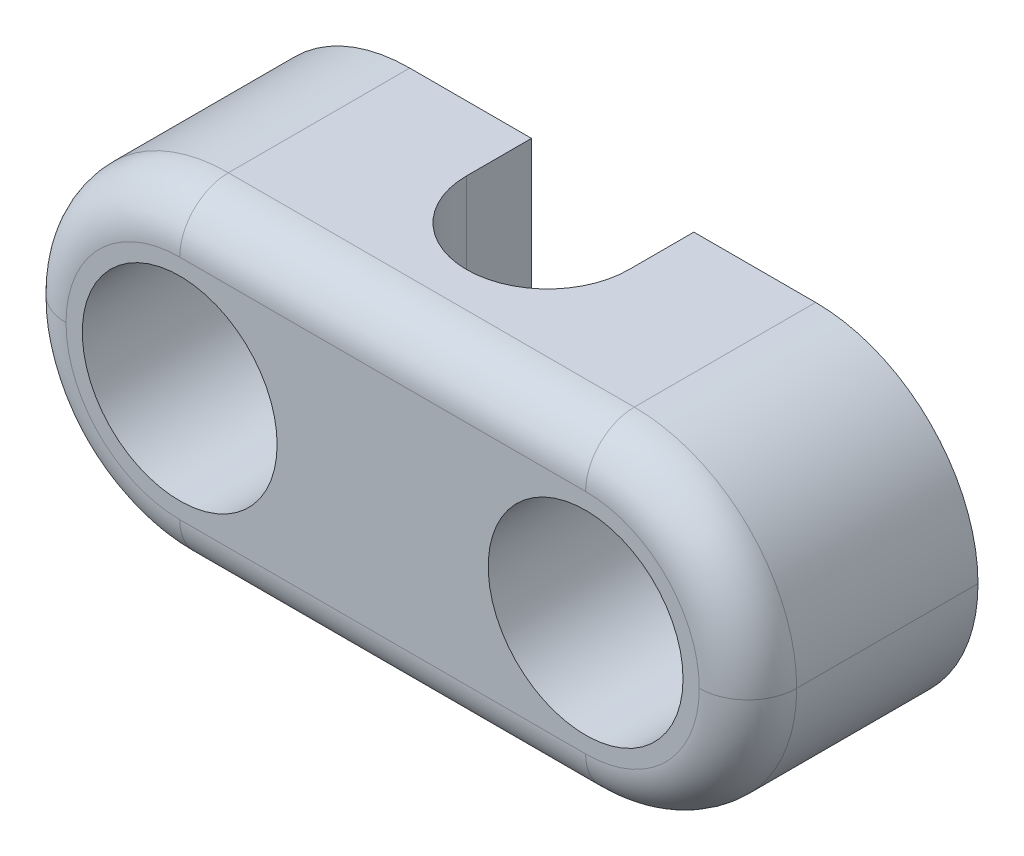
ISO-10303-21;
HEADER;
FILE_DESCRIPTION(('STEP AP214'),'2;1');
FILE_NAME('part.step','',(''),(''),'','','');
FILE_SCHEMA(('AUTOMOTIVE_DESIGN { 1 0 10303 214 1 1 1 1 }'));
ENDSEC;
DATA;
#1=APPLICATION_CONTEXT('core data for automotive mechanical design processes');
#2=APPLICATION_PROTOCOL_DEFINITION('international standard','automotive_design',2000,#1);
#3=PRODUCT_CONTEXT('',#1,'mechanical');
#4=PRODUCT('Part','Part','',(#3));
#5=PRODUCT_RELATED_PRODUCT_CATEGORY('part','',(#4));
#6=PRODUCT_DEFINITION_FORMATION('','',#4);
#7=PRODUCT_DEFINITION_CONTEXT('part definition',#1,'design');
#8=PRODUCT_DEFINITION('design','',#6,#7);
#9=PRODUCT_DEFINITION_SHAPE('','',#8);
#10=(LENGTH_UNIT() NAMED_UNIT(*) SI_UNIT(.MILLI.,.METRE.));
#11=(NAMED_UNIT(*) PLANE_ANGLE_UNIT() SI_UNIT($,.RADIAN.));
#12=(NAMED_UNIT(*) SI_UNIT($,.STERADIAN.) SOLID_ANGLE_UNIT());
#13=UNCERTAINTY_MEASURE_WITH_UNIT(LENGTH_MEASURE(1.E-05),#10,'distance_accuracy_value','');
#14=(GEOMETRIC_REPRESENTATION_CONTEXT(3) GLOBAL_UNCERTAINTY_ASSIGNED_CONTEXT((#13)) GLOBAL_UNIT_ASSIGNED_CONTEXT((#10,
#11,#12)) REPRESENTATION_CONTEXT('',''));
#15=CARTESIAN_POINT('',(0.,0.,0.));
#16=DIRECTION('',(0.,0.,1.));
#17=DIRECTION('',(1.,0.,0.));
#18=AXIS2_PLACEMENT_3D('',#15,#16,#17);
#19=CARTESIAN_POINT('',(0.,0.,0.));
#20=DIRECTION('',(0.,0.,-1.));
#21=DIRECTION('',(-1.,0.,0.));
#22=AXIS2_PLACEMENT_3D('',#19,#20,#21);
#23=PLANE('',#22);
#24=DIRECTION('',(0.,1.,0.));
#25=VECTOR('',#24,1.);
#26=CARTESIAN_POINT('',(-5.,0.,0.));
#27=LINE('',#26,#25);
#28=CARTESIAN_POINT('',(-5.,-10.,0.));
#29=VERTEX_POINT('',#28);
#30=CARTESIAN_POINT('',(-5.,10.,0.));
#31=VERTEX_POINT('',#30);
#32=EDGE_CURVE('E147',#29,#31,#27,.T.);
#33=ORIENTED_EDGE('',*,*,#32,.F.);
#34=DIRECTION('',(1.,0.,0.));
#35=VECTOR('',#34,1.);
#36=CARTESIAN_POINT('',(-22.5,-10.,0.));
#37=LINE('',#36,#35);
#38=CARTESIAN_POINT('',(-12.5,-10.,0.));
#39=VERTEX_POINT('',#38);
#40=EDGE_CURVE('E163',#39,#29,#37,.T.);
#41=ORIENTED_EDGE('',*,*,#40,.F.);
#42=CARTESIAN_POINT('',(-12.5,0.,0.));
#43=DIRECTION('',(0.,0.,-1.));
#44=DIRECTION('',(-1.,0.,0.));
#45=AXIS2_PLACEMENT_3D('',#42,#43,#44);
#46=CIRCLE('',#45,10.);
#47=CARTESIAN_POINT('',(-22.5,0.,0.));
#48=VERTEX_POINT('',#47);
#49=EDGE_CURVE('E176',#39,#48,#46,.T.);
#50=ORIENTED_EDGE('',*,*,#49,.T.);
#51=CARTESIAN_POINT('',(-12.5,0.,0.));
#52=DIRECTION('',(0.,0.,-1.));
#53=DIRECTION('',(-1.,0.,0.));
#54=AXIS2_PLACEMENT_3D('',#51,#52,#53);
#55=CIRCLE('',#54,10.);
#56=CARTESIAN_POINT('',(-12.5,10.,0.));
#57=VERTEX_POINT('',#56);
#58=EDGE_CURVE('E178',#48,#57,#55,.T.);
#59=ORIENTED_EDGE('',*,*,#58,.T.);
#60=DIRECTION('',(-1.,0.,0.));
#61=VECTOR('',#60,1.);
#62=CARTESIAN_POINT('',(-22.5,10.,0.));
#63=LINE('',#62,#61);
#64=EDGE_CURVE('E168',#31,#57,#63,.T.);
#65=ORIENTED_EDGE('',*,*,#64,.F.);
#66=EDGE_LOOP('',(#33,#41,#50,#59,#65));
#67=FACE_BOUND('',#66,.T.);
#68=CARTESIAN_POINT('',(-12.5,0.,0.));
#69=DIRECTION('',(0.,0.,1.));
#70=DIRECTION('',(1.,0.,0.));
#71=AXIS2_PLACEMENT_3D('',#68,#69,#70);
#72=CIRCLE('',#71,2.75);
#73=CARTESIAN_POINT('',(-9.75,0.,0.));
#74=VERTEX_POINT('',#73);
#75=EDGE_CURVE('E247',#74,#74,#72,.T.);
#76=ORIENTED_EDGE('',*,*,#75,.T.);
#77=EDGE_LOOP('',(#76));
#78=FACE_BOUND('',#77,.T.);
#79=ADVANCED_FACE('F38',(#67,#78),#23,.T.);
#80=CARTESIAN_POINT('',(-22.5,10.,14.1678726496991));
#81=DIRECTION('',(0.,-1.,0.));
#82=DIRECTION('',(0.,0.,-1.));
#83=AXIS2_PLACEMENT_3D('',#80,#81,#82);
#84=PLANE('',#83);
#85=DIRECTION('',(0.,0.,-1.));
#86=VECTOR('',#85,1.);
#87=CARTESIAN_POINT('',(-12.5,10.,14.1678726496991));
#88=LINE('',#87,#86);
#89=CARTESIAN_POINT('',(-12.5,10.,11.1678726496991));
#90=VERTEX_POINT('',#89);
#91=EDGE_CURVE('E167',#57,#90,#88,.F.);
#92=ORIENTED_EDGE('',*,*,#91,.T.);
#93=DIRECTION('',(-1.,0.,0.));
#94=VECTOR('',#93,1.);
#95=CARTESIAN_POINT('',(-22.5,10.,11.1678726496991));
#96=LINE('',#95,#94);
#97=CARTESIAN_POINT('',(12.5,10.,11.1678726496991));
#98=VERTEX_POINT('',#97);
#99=EDGE_CURVE('E212',#90,#98,#96,.F.);
#100=ORIENTED_EDGE('',*,*,#99,.T.);
#101=DIRECTION('',(0.,0.,-1.));
#102=VECTOR('',#101,1.);
#103=CARTESIAN_POINT('',(12.5,10.,14.1678726496991));
#104=LINE('',#103,#102);
#105=CARTESIAN_POINT('',(12.5,10.,0.));
#106=VERTEX_POINT('',#105);
#107=EDGE_CURVE('E174',#98,#106,#104,.T.);
#108=ORIENTED_EDGE('',*,*,#107,.T.);
#109=CARTESIAN_POINT('',(4.99999999999999,10.,0.));
#110=VERTEX_POINT('',#109);
#111=EDGE_CURVE('E164',#106,#110,#63,.T.);
#112=ORIENTED_EDGE('',*,*,#111,.T.);
#113=DIRECTION('',(0.,0.,1.));
#114=VECTOR('',#113,1.);
#115=CARTESIAN_POINT('',(5.,10.,14.1678726496991));
#116=LINE('',#115,#114);
#117=CARTESIAN_POINT('',(5.,10.,4.));
#118=VERTEX_POINT('',#117);
#119=EDGE_CURVE('E142',#110,#118,#116,.T.);
#120=ORIENTED_EDGE('',*,*,#119,.T.);
#121=CARTESIAN_POINT('',(0.,10.,4.));
#122=DIRECTION('',(0.,-1.,0.));
#123=DIRECTION('',(0.,0.,-1.));
#124=AXIS2_PLACEMENT_3D('',#121,#122,#123);
#125=CIRCLE('',#124,5.);
#126=CARTESIAN_POINT('',(-5.,10.,4.));
#127=VERTEX_POINT('',#126);
#128=EDGE_CURVE('E191',#118,#127,#125,.T.);
#129=ORIENTED_EDGE('',*,*,#128,.T.);
#130=DIRECTION('',(0.,0.,-1.));
#131=VECTOR('',#130,1.);
#132=CARTESIAN_POINT('',(-5.,10.,14.1678726496991));
#133=LINE('',#132,#131);
#134=EDGE_CURVE('E269',#127,#31,#133,.T.);
#135=ORIENTED_EDGE('',*,*,#134,.T.);
#136=ORIENTED_EDGE('',*,*,#64,.T.);
#137=EDGE_LOOP('',(#92,#100,#108,#112,#120,#129,#135,#136));
#138=FACE_BOUND('',#137,.T.);
#139=ADVANCED_FACE('F273',(#138),#84,.F.);
#140=CARTESIAN_POINT('',(-22.5,-10.,14.1678726496991));
#141=DIRECTION('',(0.,1.,0.));
#142=DIRECTION('',(0.,0.,1.));
#143=AXIS2_PLACEMENT_3D('',#140,#141,#142);
#144=PLANE('',#143);
#145=DIRECTION('',(0.,0.,-1.));
#146=VECTOR('',#145,1.);
#147=CARTESIAN_POINT('',(12.5,-10.,14.1678726496991));
#148=LINE('',#147,#146);
#149=CARTESIAN_POINT('',(12.5,-10.,0.));
#150=VERTEX_POINT('',#149);
#151=CARTESIAN_POINT('',(12.5,-10.,11.1678726496991));
#152=VERTEX_POINT('',#151);
#153=EDGE_CURVE('E148',#150,#152,#148,.F.);
#154=ORIENTED_EDGE('',*,*,#153,.T.);
#155=DIRECTION('',(1.,0.,0.));
#156=VECTOR('',#155,1.);
#157=CARTESIAN_POINT('',(-22.5,-10.,11.1678726496991));
#158=LINE('',#157,#156);
#159=CARTESIAN_POINT('',(-12.5,-10.,11.1678726496991));
#160=VERTEX_POINT('',#159);
#161=EDGE_CURVE('E11',#152,#160,#158,.F.);
#162=ORIENTED_EDGE('',*,*,#161,.T.);
#163=DIRECTION('',(0.,0.,-1.));
#164=VECTOR('',#163,1.);
#165=CARTESIAN_POINT('',(-12.5,-10.,14.1678726496991));
#166=LINE('',#165,#164);
#167=EDGE_CURVE('E184',#160,#39,#166,.T.);
#168=ORIENTED_EDGE('',*,*,#167,.T.);
#169=ORIENTED_EDGE('',*,*,#40,.T.);
#170=DIRECTION('',(0.,0.,-1.));
#171=VECTOR('',#170,1.);
#172=CARTESIAN_POINT('',(-5.,-10.,0.));
#173=LINE('',#172,#171);
#174=CARTESIAN_POINT('',(-5.,-10.,4.));
#175=VERTEX_POINT('',#174);
#176=EDGE_CURVE('E262',#175,#29,#173,.T.);
#177=ORIENTED_EDGE('',*,*,#176,.F.);
#178=CARTESIAN_POINT('',(0.,-10.,4.));
#179=DIRECTION('',(0.,-1.,0.));
#180=DIRECTION('',(0.,0.,-1.));
#181=AXIS2_PLACEMENT_3D('',#178,#179,#180);
#182=CIRCLE('',#181,5.);
#183=CARTESIAN_POINT('',(5.,-10.,4.));
#184=VERTEX_POINT('',#183);
#185=EDGE_CURVE('E156',#184,#175,#182,.T.);
#186=ORIENTED_EDGE('',*,*,#185,.F.);
#187=DIRECTION('',(0.,0.,1.));
#188=VECTOR('',#187,1.);
#189=CARTESIAN_POINT('',(5.,-10.,0.));
#190=LINE('',#189,#188);
#191=CARTESIAN_POINT('',(5.,-10.,0.));
#192=VERTEX_POINT('',#191);
#193=EDGE_CURVE('E139',#192,#184,#190,.T.);
#194=ORIENTED_EDGE('',*,*,#193,.F.);
#195=EDGE_CURVE('E152',#192,#150,#37,.T.);
#196=ORIENTED_EDGE('',*,*,#195,.T.);
#197=EDGE_LOOP('',(#154,#162,#168,#169,#177,#186,#194,#196));
#198=FACE_BOUND('',#197,.T.);
#199=ADVANCED_FACE('F151',(#198),#144,.F.);
#200=CARTESIAN_POINT('',(0.,0.,14.1678726496991));
#201=DIRECTION('',(0.,0.,-1.));
#202=DIRECTION('',(-1.,0.,0.));
#203=AXIS2_PLACEMENT_3D('',#200,#201,#202);
#204=PLANE('',#203);
#205=CARTESIAN_POINT('',(-12.5,0.,14.1678726496991));
#206=DIRECTION('',(0.,0.,-1.));
#207=DIRECTION('',(-1.,0.,0.));
#208=AXIS2_PLACEMENT_3D('',#205,#206,#207);
#209=CIRCLE('',#208,7.);
#210=CARTESIAN_POINT('',(-12.5,7.,14.1678726496991));
#211=VERTEX_POINT('',#210);
#212=CARTESIAN_POINT('',(-19.5,0.,14.1678726496991));
#213=VERTEX_POINT('',#212);
#214=EDGE_CURVE('E202',#211,#213,#209,.F.);
#215=ORIENTED_EDGE('',*,*,#214,.T.);
#216=CARTESIAN_POINT('',(-12.5,0.,14.1678726496991));
#217=DIRECTION('',(0.,0.,-1.));
#218=DIRECTION('',(-1.,0.,0.));
#219=AXIS2_PLACEMENT_3D('',#216,#217,#218);
#220=CIRCLE('',#219,7.);
#221=CARTESIAN_POINT('',(-12.5,-7.,14.1678726496991));
#222=VERTEX_POINT('',#221);
#223=EDGE_CURVE('E204',#213,#222,#220,.F.);
#224=ORIENTED_EDGE('',*,*,#223,.T.);
#225=DIRECTION('',(1.,0.,0.));
#226=VECTOR('',#225,1.);
#227=CARTESIAN_POINT('',(0.,-7.,14.1678726496991));
#228=LINE('',#227,#226);
#229=CARTESIAN_POINT('',(12.5,-7.,14.1678726496991));
#230=VERTEX_POINT('',#229);
#231=EDGE_CURVE('E194',#222,#230,#228,.T.);
#232=ORIENTED_EDGE('',*,*,#231,.T.);
#233=CARTESIAN_POINT('',(12.5,0.,14.1678726496991));
#234=DIRECTION('',(0.,0.,-1.));
#235=DIRECTION('',(-1.,0.,0.));
#236=AXIS2_PLACEMENT_3D('',#233,#234,#235);
#237=CIRCLE('',#236,7.);
#238=CARTESIAN_POINT('',(19.5,0.,14.1678726496991));
#239=VERTEX_POINT('',#238);
#240=EDGE_CURVE('E196',#230,#239,#237,.F.);
#241=ORIENTED_EDGE('',*,*,#240,.T.);
#242=CARTESIAN_POINT('',(12.5,0.,14.1678726496991));
#243=DIRECTION('',(0.,0.,-1.));
#244=DIRECTION('',(-1.,0.,0.));
#245=AXIS2_PLACEMENT_3D('',#242,#243,#244);
#246=CIRCLE('',#245,7.);
#247=CARTESIAN_POINT('',(12.5,7.,14.1678726496991));
#248=VERTEX_POINT('',#247);
#249=EDGE_CURVE('E198',#239,#248,#246,.F.);
#250=ORIENTED_EDGE('',*,*,#249,.T.);
#251=DIRECTION('',(-1.,0.,0.));
#252=VECTOR('',#251,1.);
#253=CARTESIAN_POINT('',(0.,7.,14.1678726496991));
#254=LINE('',#253,#252);
#255=EDGE_CURVE('E200',#248,#211,#254,.T.);
#256=ORIENTED_EDGE('',*,*,#255,.T.);
#257=EDGE_LOOP('',(#215,#224,#232,#241,#250,#256));
#258=FACE_BOUND('',#257,.T.);
#259=CARTESIAN_POINT('',(-12.5,0.,14.1678726496991));
#260=DIRECTION('',(0.,0.,1.));
#261=DIRECTION('',(1.,0.,0.));
#262=AXIS2_PLACEMENT_3D('',#259,#260,#261);
#263=CIRCLE('',#262,6.);
#264=CARTESIAN_POINT('',(-6.5,0.,14.1678726496991));
#265=VERTEX_POINT('',#264);
#266=EDGE_CURVE('E231',#265,#265,#263,.T.);
#267=ORIENTED_EDGE('',*,*,#266,.F.);
#268=EDGE_LOOP('',(#267));
#269=FACE_BOUND('',#268,.T.);
#270=CARTESIAN_POINT('',(12.5,0.,14.1678726496991));
#271=DIRECTION('',(0.,0.,1.));
#272=DIRECTION('',(1.,0.,0.));
#273=AXIS2_PLACEMENT_3D('',#270,#271,#272);
#274=CIRCLE('',#273,6.);
#275=CARTESIAN_POINT('',(18.5,0.,14.1678726496991));
#276=VERTEX_POINT('',#275);
#277=EDGE_CURVE('E250',#276,#276,#274,.T.);
#278=ORIENTED_EDGE('',*,*,#277,.F.);
#279=EDGE_LOOP('',(#278));
#280=FACE_BOUND('',#279,.T.);
#281=ADVANCED_FACE('F302',(#258,#269,#280),#204,.F.);
#282=CARTESIAN_POINT('',(12.5,0.,0.));
#283=DIRECTION('',(0.,0.,1.));
#284=DIRECTION('',(1.,0.,0.));
#285=AXIS2_PLACEMENT_3D('',#282,#283,#284);
#286=CIRCLE('',#285,2.75);
#287=CARTESIAN_POINT('',(15.25,0.,0.));
#288=VERTEX_POINT('',#287);
#289=EDGE_CURVE('E157',#288,#288,#286,.T.);
#290=ORIENTED_EDGE('',*,*,#289,.T.);
#291=EDGE_LOOP('',(#290));
#292=FACE_BOUND('',#291,.T.);
#293=DIRECTION('',(0.,-1.,0.));
#294=VECTOR('',#293,1.);
#295=CARTESIAN_POINT('',(5.,0.,0.));
#296=LINE('',#295,#294);
#297=EDGE_CURVE('E135',#110,#192,#296,.T.);
#298=ORIENTED_EDGE('',*,*,#297,.F.);
#299=ORIENTED_EDGE('',*,*,#111,.F.);
#300=CARTESIAN_POINT('',(12.5,0.,0.));
#301=DIRECTION('',(0.,0.,-1.));
#302=DIRECTION('',(-1.,0.,0.));
#303=AXIS2_PLACEMENT_3D('',#300,#301,#302);
#304=CIRCLE('',#303,10.);
#305=CARTESIAN_POINT('',(22.5,0.,0.));
#306=VERTEX_POINT('',#305);
#307=EDGE_CURVE('E182',#106,#306,#304,.T.);
#308=ORIENTED_EDGE('',*,*,#307,.T.);
#309=CARTESIAN_POINT('',(12.5,0.,0.));
#310=DIRECTION('',(0.,0.,-1.));
#311=DIRECTION('',(-1.,0.,0.));
#312=AXIS2_PLACEMENT_3D('',#309,#310,#311);
#313=CIRCLE('',#312,10.);
#314=EDGE_CURVE('E162',#306,#150,#313,.T.);
#315=ORIENTED_EDGE('',*,*,#314,.T.);
#316=ORIENTED_EDGE('',*,*,#195,.F.);
#317=EDGE_LOOP('',(#298,#299,#308,#315,#316));
#318=FACE_BOUND('',#317,.T.);
#319=ADVANCED_FACE('F159',(#292,#318),#23,.T.);
#320=CARTESIAN_POINT('',(12.5,0.,14.1678726496991));
#321=DIRECTION('',(0.,0.,-1.));
#322=DIRECTION('',(-1.,0.,0.));
#323=AXIS2_PLACEMENT_3D('',#320,#321,#322);
#324=CYLINDRICAL_SURFACE('',#323,10.);
#325=DIRECTION('',(0.,0.,-1.));
#326=VECTOR('',#325,1.);
#327=CARTESIAN_POINT('',(22.5,0.,14.1678726496991));
#328=LINE('',#327,#326);
#329=CARTESIAN_POINT('',(22.5,0.,11.1678726496991));
#330=VERTEX_POINT('',#329);
#331=EDGE_CURVE('E187',#330,#306,#328,.T.);
#332=ORIENTED_EDGE('',*,*,#331,.F.);
#333=CARTESIAN_POINT('',(12.5,0.,11.1678726496991));
#334=DIRECTION('',(0.,0.,-1.));
#335=DIRECTION('',(-1.,0.,0.));
#336=AXIS2_PLACEMENT_3D('',#333,#334,#335);
#337=CIRCLE('',#336,10.);
#338=EDGE_CURVE('E47',#330,#152,#337,.T.);
#339=ORIENTED_EDGE('',*,*,#338,.T.);
#340=ORIENTED_EDGE('',*,*,#153,.F.);
#341=ORIENTED_EDGE('',*,*,#314,.F.);
#342=EDGE_LOOP('',(#332,#339,#340,#341));
#343=FACE_BOUND('',#342,.T.);
#344=ADVANCED_FACE('F331',(#343),#324,.T.);
#345=CARTESIAN_POINT('',(12.5,0.,14.1678726496991));
#346=DIRECTION('',(0.,0.,-1.));
#347=DIRECTION('',(-1.,0.,0.));
#348=AXIS2_PLACEMENT_3D('',#345,#346,#347);
#349=CYLINDRICAL_SURFACE('',#348,10.);
#350=ORIENTED_EDGE('',*,*,#107,.F.);
#351=CARTESIAN_POINT('',(12.5,0.,11.1678726496991));
#352=DIRECTION('',(0.,0.,-1.));
#353=DIRECTION('',(-1.,0.,0.));
#354=AXIS2_PLACEMENT_3D('',#351,#352,#353);
#355=CIRCLE('',#354,10.);
#356=EDGE_CURVE('E62',#98,#330,#355,.T.);
#357=ORIENTED_EDGE('',*,*,#356,.T.);
#358=ORIENTED_EDGE('',*,*,#331,.T.);
#359=ORIENTED_EDGE('',*,*,#307,.F.);
#360=EDGE_LOOP('',(#350,#357,#358,#359));
#361=FACE_BOUND('',#360,.T.);
#362=ADVANCED_FACE('F337',(#361),#349,.T.);
#363=CARTESIAN_POINT('',(-12.5,0.,14.1678726496991));
#364=DIRECTION('',(0.,0.,-1.));
#365=DIRECTION('',(-1.,0.,0.));
#366=AXIS2_PLACEMENT_3D('',#363,#364,#365);
#367=CYLINDRICAL_SURFACE('',#366,10.);
#368=ORIENTED_EDGE('',*,*,#167,.F.);
#369=CARTESIAN_POINT('',(-12.5,0.,11.1678726496991));
#370=DIRECTION('',(0.,0.,-1.));
#371=DIRECTION('',(-1.,0.,0.));
#372=AXIS2_PLACEMENT_3D('',#369,#370,#371);
#373=CIRCLE('',#372,10.);
#374=CARTESIAN_POINT('',(-22.5,0.,11.1678726496991));
#375=VERTEX_POINT('',#374);
#376=EDGE_CURVE('E207',#160,#375,#373,.T.);
#377=ORIENTED_EDGE('',*,*,#376,.T.);
#378=DIRECTION('',(0.,0.,-1.));
#379=VECTOR('',#378,1.);
#380=CARTESIAN_POINT('',(-22.5,0.,14.1678726496991));
#381=LINE('',#380,#379);
#382=EDGE_CURVE('E189',#48,#375,#381,.F.);
#383=ORIENTED_EDGE('',*,*,#382,.F.);
#384=ORIENTED_EDGE('',*,*,#49,.F.);
#385=EDGE_LOOP('',(#368,#377,#383,#384));
#386=FACE_BOUND('',#385,.T.);
#387=ADVANCED_FACE('F289',(#386),#367,.T.);
#388=CARTESIAN_POINT('',(-12.5,0.,14.1678726496991));
#389=DIRECTION('',(0.,0.,-1.));
#390=DIRECTION('',(-1.,0.,0.));
#391=AXIS2_PLACEMENT_3D('',#388,#389,#390);
#392=CYLINDRICAL_SURFACE('',#391,10.);
#393=ORIENTED_EDGE('',*,*,#382,.T.);
#394=CARTESIAN_POINT('',(-12.5,0.,11.1678726496991));
#395=DIRECTION('',(0.,0.,-1.));
#396=DIRECTION('',(-1.,0.,0.));
#397=AXIS2_PLACEMENT_3D('',#394,#395,#396);
#398=CIRCLE('',#397,10.);
#399=EDGE_CURVE('E210',#375,#90,#398,.T.);
#400=ORIENTED_EDGE('',*,*,#399,.T.);
#401=ORIENTED_EDGE('',*,*,#91,.F.);
#402=ORIENTED_EDGE('',*,*,#58,.F.);
#403=EDGE_LOOP('',(#393,#400,#401,#402));
#404=FACE_BOUND('',#403,.T.);
#405=ADVANCED_FACE('F310',(#404),#392,.T.);
#406=CARTESIAN_POINT('',(0.,12.,4.));
#407=DIRECTION('',(0.,-1.,0.));
#408=DIRECTION('',(0.,0.,-1.));
#409=AXIS2_PLACEMENT_3D('',#406,#407,#408);
#410=CYLINDRICAL_SURFACE('',#409,5.);
#411=DIRECTION('',(0.,-1.,0.));
#412=VECTOR('',#411,1.);
#413=CARTESIAN_POINT('',(5.,12.,4.));
#414=LINE('',#413,#412);
#415=EDGE_CURVE('E264',#118,#184,#414,.T.);
#416=ORIENTED_EDGE('',*,*,#415,.T.);
#417=ORIENTED_EDGE('',*,*,#185,.T.);
#418=DIRECTION('',(0.,-1.,0.));
#419=VECTOR('',#418,1.);
#420=CARTESIAN_POINT('',(-5.,12.,4.));
#421=LINE('',#420,#419);
#422=EDGE_CURVE('E265',#127,#175,#421,.T.);
#423=ORIENTED_EDGE('',*,*,#422,.F.);
#424=ORIENTED_EDGE('',*,*,#128,.F.);
#425=EDGE_LOOP('',(#416,#417,#423,#424));
#426=FACE_BOUND('',#425,.T.);
#427=ADVANCED_FACE('F277',(#426),#410,.F.);
#428=CARTESIAN_POINT('',(-5.,12.,0.));
#429=DIRECTION('',(-1.,0.,0.));
#430=DIRECTION('',(0.,0.,1.));
#431=AXIS2_PLACEMENT_3D('',#428,#429,#430);
#432=PLANE('',#431);
#433=ORIENTED_EDGE('',*,*,#422,.T.);
#434=ORIENTED_EDGE('',*,*,#176,.T.);
#435=ORIENTED_EDGE('',*,*,#32,.T.);
#436=ORIENTED_EDGE('',*,*,#134,.F.);
#437=EDGE_LOOP('',(#433,#434,#435,#436));
#438=FACE_BOUND('',#437,.T.);
#439=ADVANCED_FACE('F279',(#438),#432,.F.);
#440=CARTESIAN_POINT('',(5.,12.,0.));
#441=DIRECTION('',(1.,0.,0.));
#442=DIRECTION('',(0.,0.,-1.));
#443=AXIS2_PLACEMENT_3D('',#440,#441,#442);
#444=PLANE('',#443);
#445=ORIENTED_EDGE('',*,*,#297,.T.);
#446=ORIENTED_EDGE('',*,*,#193,.T.);
#447=ORIENTED_EDGE('',*,*,#415,.F.);
#448=ORIENTED_EDGE('',*,*,#119,.F.);
#449=EDGE_LOOP('',(#445,#446,#447,#448));
#450=FACE_BOUND('',#449,.T.);
#451=ADVANCED_FACE('F137',(#450),#444,.F.);
#452=CARTESIAN_POINT('',(12.5,0.,14.1678726496991));
#453=DIRECTION('',(0.,0.,1.));
#454=DIRECTION('',(1.,0.,0.));
#455=AXIS2_PLACEMENT_3D('',#452,#453,#454);
#456=CYLINDRICAL_SURFACE('',#455,2.75);
#457=ORIENTED_EDGE('',*,*,#289,.F.);
#458=EDGE_LOOP('',(#457));
#459=FACE_BOUND('',#458,.T.);
#460=CARTESIAN_POINT('',(12.5,0.,4.16787264969908));
#461=DIRECTION('',(0.,0.,1.));
#462=DIRECTION('',(1.,0.,0.));
#463=AXIS2_PLACEMENT_3D('',#460,#461,#462);
#464=CIRCLE('',#463,2.75);
#465=CARTESIAN_POINT('',(15.25,0.,4.16787264969908));
#466=VERTEX_POINT('',#465);
#467=EDGE_CURVE('E256',#466,#466,#464,.T.);
#468=ORIENTED_EDGE('',*,*,#467,.T.);
#469=EDGE_LOOP('',(#468));
#470=FACE_BOUND('',#469,.T.);
#471=ADVANCED_FACE('F341',(#459,#470),#456,.F.);
#472=CARTESIAN_POINT('',(15.25,0.,4.16787264969908));
#473=DIRECTION('',(0.,0.,-1.));
#474=DIRECTION('',(-1.,0.,0.));
#475=AXIS2_PLACEMENT_3D('',#472,#473,#474);
#476=PLANE('',#475);
#477=ORIENTED_EDGE('',*,*,#467,.F.);
#478=EDGE_LOOP('',(#477));
#479=FACE_BOUND('',#478,.T.);
#480=CARTESIAN_POINT('',(12.5,0.,4.16787264969908));
#481=DIRECTION('',(0.,0.,1.));
#482=DIRECTION('',(1.,0.,0.));
#483=AXIS2_PLACEMENT_3D('',#480,#481,#482);
#484=CIRCLE('',#483,6.);
#485=CARTESIAN_POINT('',(18.5,0.,4.16787264969908));
#486=VERTEX_POINT('',#485);
#487=EDGE_CURVE('E253',#486,#486,#484,.T.);
#488=ORIENTED_EDGE('',*,*,#487,.T.);
#489=EDGE_LOOP('',(#488));
#490=FACE_BOUND('',#489,.T.);
#491=ADVANCED_FACE('F344',(#479,#490),#476,.F.);
#492=CARTESIAN_POINT('',(12.5,0.,14.1678726496991));
#493=DIRECTION('',(0.,0.,1.));
#494=DIRECTION('',(1.,0.,0.));
#495=AXIS2_PLACEMENT_3D('',#492,#493,#494);
#496=CYLINDRICAL_SURFACE('',#495,6.);
#497=ORIENTED_EDGE('',*,*,#487,.F.);
#498=EDGE_LOOP('',(#497));
#499=FACE_BOUND('',#498,.T.);
#500=ORIENTED_EDGE('',*,*,#277,.T.);
#501=EDGE_LOOP('',(#500));
#502=FACE_BOUND('',#501,.T.);
#503=ADVANCED_FACE('F350',(#499,#502),#496,.F.);
#504=CARTESIAN_POINT('',(-12.5,0.,14.1678726496991));
#505=DIRECTION('',(0.,0.,1.));
#506=DIRECTION('',(1.,0.,0.));
#507=AXIS2_PLACEMENT_3D('',#504,#505,#506);
#508=CYLINDRICAL_SURFACE('',#507,2.75);
#509=ORIENTED_EDGE('',*,*,#75,.F.);
#510=EDGE_LOOP('',(#509));
#511=FACE_BOUND('',#510,.T.);
#512=CARTESIAN_POINT('',(-12.5,0.,4.16787264969908));
#513=DIRECTION('',(0.,0.,1.));
#514=DIRECTION('',(1.,0.,0.));
#515=AXIS2_PLACEMENT_3D('',#512,#513,#514);
#516=CIRCLE('',#515,2.75);
#517=CARTESIAN_POINT('',(-9.75,0.,4.16787264969908));
#518=VERTEX_POINT('',#517);
#519=EDGE_CURVE('E242',#518,#518,#516,.T.);
#520=ORIENTED_EDGE('',*,*,#519,.T.);
#521=EDGE_LOOP('',(#520));
#522=FACE_BOUND('',#521,.T.);
#523=ADVANCED_FACE('F356',(#511,#522),#508,.F.);
#524=CARTESIAN_POINT('',(-9.75,0.,4.16787264969908));
#525=DIRECTION('',(0.,0.,-1.));
#526=DIRECTION('',(-1.,0.,0.));
#527=AXIS2_PLACEMENT_3D('',#524,#525,#526);
#528=PLANE('',#527);
#529=ORIENTED_EDGE('',*,*,#519,.F.);
#530=EDGE_LOOP('',(#529));
#531=FACE_BOUND('',#530,.T.);
#532=CARTESIAN_POINT('',(-12.5,0.,4.16787264969908));
#533=DIRECTION('',(0.,0.,1.));
#534=DIRECTION('',(1.,0.,0.));
#535=AXIS2_PLACEMENT_3D('',#532,#533,#534);
#536=CIRCLE('',#535,6.);
#537=CARTESIAN_POINT('',(-6.5,0.,4.16787264969908));
#538=VERTEX_POINT('',#537);
#539=EDGE_CURVE('E237',#538,#538,#536,.T.);
#540=ORIENTED_EDGE('',*,*,#539,.T.);
#541=EDGE_LOOP('',(#540));
#542=FACE_BOUND('',#541,.T.);
#543=ADVANCED_FACE('F363',(#531,#542),#528,.F.);
#544=CARTESIAN_POINT('',(-12.5,0.,14.1678726496991));
#545=DIRECTION('',(0.,0.,1.));
#546=DIRECTION('',(1.,0.,0.));
#547=AXIS2_PLACEMENT_3D('',#544,#545,#546);
#548=CYLINDRICAL_SURFACE('',#547,6.);
#549=ORIENTED_EDGE('',*,*,#539,.F.);
#550=EDGE_LOOP('',(#549));
#551=FACE_BOUND('',#550,.T.);
#552=ORIENTED_EDGE('',*,*,#266,.T.);
#553=EDGE_LOOP('',(#552));
#554=FACE_BOUND('',#553,.T.);
#555=ADVANCED_FACE('F320',(#551,#554),#548,.F.);
#556=CARTESIAN_POINT('',(12.5,0.,11.1678726496991));
#557=DIRECTION('',(0.,0.,-1.));
#558=DIRECTION('',(-1.,0.,0.));
#559=AXIS2_PLACEMENT_3D('',#556,#557,#558);
#560=TOROIDAL_SURFACE('',#559,7.,3.);
#561=CARTESIAN_POINT('',(19.5,0.,11.1678726496991));
#562=DIRECTION('',(0.,-1.,0.));
#563=DIRECTION('',(0.,0.,-1.));
#564=AXIS2_PLACEMENT_3D('',#561,#562,#563);
#565=CIRCLE('',#564,3.);
#566=EDGE_CURVE('E225',#330,#239,#565,.T.);
#567=ORIENTED_EDGE('',*,*,#566,.F.);
#568=ORIENTED_EDGE('',*,*,#356,.F.);
#569=CARTESIAN_POINT('',(12.5,7.,11.1678726496991));
#570=DIRECTION('',(-1.,0.,0.));
#571=DIRECTION('',(0.,0.,1.));
#572=AXIS2_PLACEMENT_3D('',#569,#570,#571);
#573=CIRCLE('',#572,3.);
#574=EDGE_CURVE('E42',#248,#98,#573,.T.);
#575=ORIENTED_EDGE('',*,*,#574,.F.);
#576=ORIENTED_EDGE('',*,*,#249,.F.);
#577=EDGE_LOOP('',(#567,#568,#575,#576));
#578=FACE_BOUND('',#577,.T.);
#579=ADVANCED_FACE('F40',(#578),#560,.T.);
#580=CARTESIAN_POINT('',(0.,7.,11.1678726496991));
#581=DIRECTION('',(-1.,0.,0.));
#582=DIRECTION('',(0.,0.,1.));
#583=AXIS2_PLACEMENT_3D('',#580,#581,#582);
#584=CYLINDRICAL_SURFACE('',#583,3.);
#585=ORIENTED_EDGE('',*,*,#574,.T.);
#586=ORIENTED_EDGE('',*,*,#99,.F.);
#587=CARTESIAN_POINT('',(-12.5,7.,11.1678726496991));
#588=DIRECTION('',(-1.,0.,0.));
#589=DIRECTION('',(0.,0.,1.));
#590=AXIS2_PLACEMENT_3D('',#587,#588,#589);
#591=CIRCLE('',#590,3.);
#592=EDGE_CURVE('E223',#211,#90,#591,.T.);
#593=ORIENTED_EDGE('',*,*,#592,.F.);
#594=ORIENTED_EDGE('',*,*,#255,.F.);
#595=EDGE_LOOP('',(#585,#586,#593,#594));
#596=FACE_BOUND('',#595,.T.);
#597=ADVANCED_FACE('F312',(#596),#584,.T.);
#598=CARTESIAN_POINT('',(12.5,0.,11.1678726496991));
#599=DIRECTION('',(0.,0.,-1.));
#600=DIRECTION('',(-1.,0.,0.));
#601=AXIS2_PLACEMENT_3D('',#598,#599,#600);
#602=TOROIDAL_SURFACE('',#601,7.,3.);
#603=ORIENTED_EDGE('',*,*,#566,.T.);
#604=ORIENTED_EDGE('',*,*,#240,.F.);
#605=CARTESIAN_POINT('',(12.5,-7.,11.1678726496991));
#606=DIRECTION('',(-1.,0.,0.));
#607=DIRECTION('',(0.,0.,1.));
#608=AXIS2_PLACEMENT_3D('',#605,#606,#607);
#609=CIRCLE('',#608,3.);
#610=EDGE_CURVE('E220',#152,#230,#609,.T.);
#611=ORIENTED_EDGE('',*,*,#610,.F.);
#612=ORIENTED_EDGE('',*,*,#338,.F.);
#613=EDGE_LOOP('',(#603,#604,#611,#612));
#614=FACE_BOUND('',#613,.T.);
#615=ADVANCED_FACE('F314',(#614),#602,.T.);
#616=CARTESIAN_POINT('',(-12.5,0.,11.1678726496991));
#617=DIRECTION('',(0.,0.,-1.));
#618=DIRECTION('',(-1.,0.,0.));
#619=AXIS2_PLACEMENT_3D('',#616,#617,#618);
#620=TOROIDAL_SURFACE('',#619,7.,3.);
#621=ORIENTED_EDGE('',*,*,#592,.T.);
#622=ORIENTED_EDGE('',*,*,#399,.F.);
#623=CARTESIAN_POINT('',(-19.5,0.,11.1678726496991));
#624=DIRECTION('',(0.,-1.,0.));
#625=DIRECTION('',(0.,0.,-1.));
#626=AXIS2_PLACEMENT_3D('',#623,#624,#625);
#627=CIRCLE('',#626,3.);
#628=EDGE_CURVE('E218',#213,#375,#627,.T.);
#629=ORIENTED_EDGE('',*,*,#628,.F.);
#630=ORIENTED_EDGE('',*,*,#214,.F.);
#631=EDGE_LOOP('',(#621,#622,#629,#630));
#632=FACE_BOUND('',#631,.T.);
#633=ADVANCED_FACE('F307',(#632),#620,.T.);
#634=CARTESIAN_POINT('',(0.,-7.,11.1678726496991));
#635=DIRECTION('',(1.,0.,0.));
#636=DIRECTION('',(0.,0.,-1.));
#637=AXIS2_PLACEMENT_3D('',#634,#635,#636);
#638=CYLINDRICAL_SURFACE('',#637,3.);
#639=ORIENTED_EDGE('',*,*,#610,.T.);
#640=ORIENTED_EDGE('',*,*,#231,.F.);
#641=CARTESIAN_POINT('',(-12.5,-7.,11.1678726496991));
#642=DIRECTION('',(-1.,0.,0.));
#643=DIRECTION('',(0.,0.,1.));
#644=AXIS2_PLACEMENT_3D('',#641,#642,#643);
#645=CIRCLE('',#644,3.);
#646=EDGE_CURVE('E216',#160,#222,#645,.T.);
#647=ORIENTED_EDGE('',*,*,#646,.F.);
#648=ORIENTED_EDGE('',*,*,#161,.F.);
#649=EDGE_LOOP('',(#639,#640,#647,#648));
#650=FACE_BOUND('',#649,.T.);
#651=ADVANCED_FACE('F299',(#650),#638,.T.);
#652=CARTESIAN_POINT('',(-12.5,0.,11.1678726496991));
#653=DIRECTION('',(0.,0.,-1.));
#654=DIRECTION('',(-1.,0.,0.));
#655=AXIS2_PLACEMENT_3D('',#652,#653,#654);
#656=TOROIDAL_SURFACE('',#655,7.,3.);
#657=ORIENTED_EDGE('',*,*,#628,.T.);
#658=ORIENTED_EDGE('',*,*,#376,.F.);
#659=ORIENTED_EDGE('',*,*,#646,.T.);
#660=ORIENTED_EDGE('',*,*,#223,.F.);
#661=EDGE_LOOP('',(#657,#658,#659,#660));
#662=FACE_BOUND('',#661,.T.);
#663=ADVANCED_FACE('F293',(#662),#656,.T.);
#664=CLOSED_SHELL('',(#79,#139,#199,#281,#319,#344,#362,#387,#405,#427,#439,#451,#471,#491,#503,
#523,#543,#555,#579,#597,#615,#633,#651,#663));
#665=MANIFOLD_SOLID_BREP('B2',#664);
#666=ADVANCED_BREP_SHAPE_REPRESENTATION('',(#18,#665),#14);
#667=SHAPE_DEFINITION_REPRESENTATION(#9,#666);
ENDSEC;
END-ISO-10303-21;
